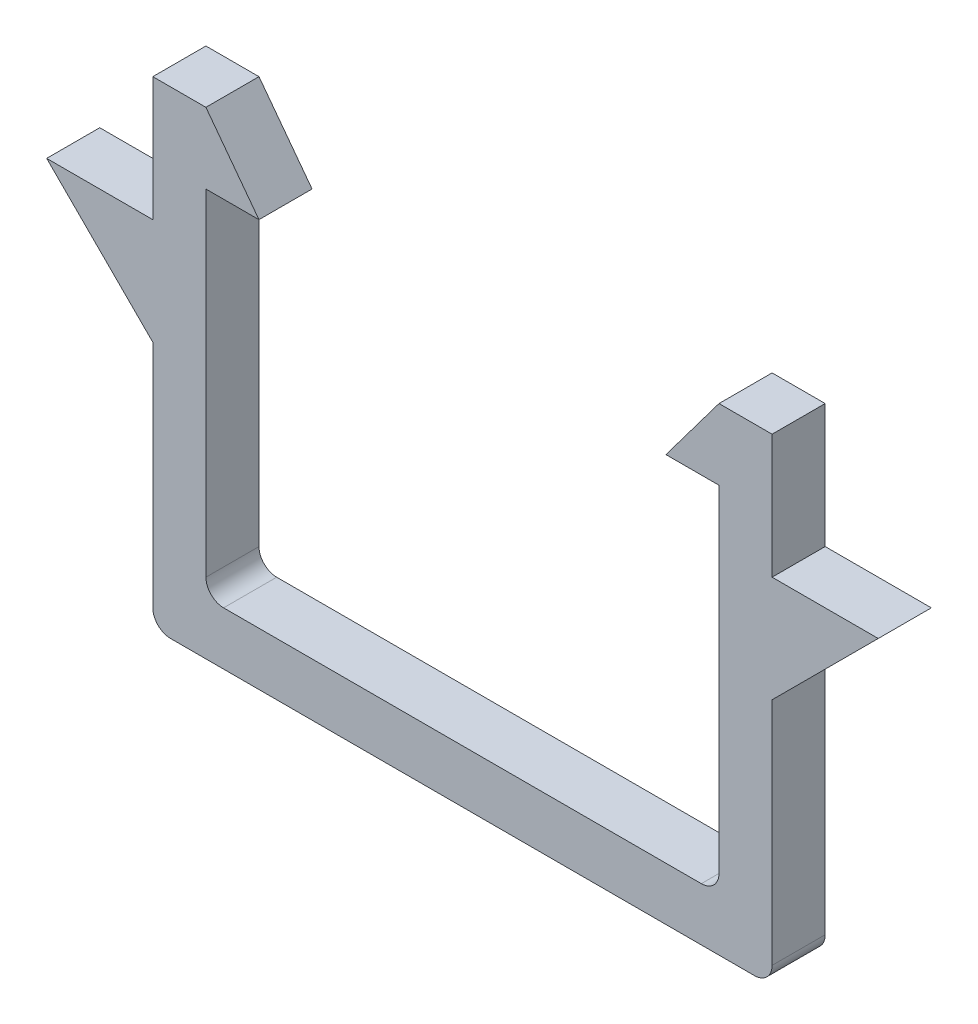
ISO-10303-21;
HEADER;
FILE_DESCRIPTION(('STEP AP214'),'2;1');
FILE_NAME('part.step','',(''),(''),'','','');
FILE_SCHEMA(('AUTOMOTIVE_DESIGN { 1 0 10303 214 1 1 1 1 }'));
ENDSEC;
DATA;
#1=APPLICATION_CONTEXT('core data for automotive mechanical design processes');
#2=APPLICATION_PROTOCOL_DEFINITION('international standard','automotive_design',2000,#1);
#3=PRODUCT_CONTEXT('',#1,'mechanical');
#4=PRODUCT('Part','Part','',(#3));
#5=PRODUCT_RELATED_PRODUCT_CATEGORY('part','',(#4));
#6=PRODUCT_DEFINITION_FORMATION('','',#4);
#7=PRODUCT_DEFINITION_CONTEXT('part definition',#1,'design');
#8=PRODUCT_DEFINITION('design','',#6,#7);
#9=PRODUCT_DEFINITION_SHAPE('','',#8);
#10=(LENGTH_UNIT() NAMED_UNIT(*) SI_UNIT(.MILLI.,.METRE.));
#11=(NAMED_UNIT(*) PLANE_ANGLE_UNIT() SI_UNIT($,.RADIAN.));
#12=(NAMED_UNIT(*) SI_UNIT($,.STERADIAN.) SOLID_ANGLE_UNIT());
#13=UNCERTAINTY_MEASURE_WITH_UNIT(LENGTH_MEASURE(1.E-05),#10,'distance_accuracy_value','');
#14=(GEOMETRIC_REPRESENTATION_CONTEXT(3) GLOBAL_UNCERTAINTY_ASSIGNED_CONTEXT((#13)) GLOBAL_UNIT_ASSIGNED_CONTEXT((#10,
#11,#12)) REPRESENTATION_CONTEXT('',''));
#15=CARTESIAN_POINT('',(0.,0.,0.));
#16=DIRECTION('',(0.,0.,1.));
#17=DIRECTION('',(1.,0.,0.));
#18=AXIS2_PLACEMENT_3D('',#15,#16,#17);
#19=CARTESIAN_POINT('',(-14.5,23.,1.5));
#20=DIRECTION('',(0.,1.,0.));
#21=DIRECTION('',(0.,0.,1.));
#22=AXIS2_PLACEMENT_3D('',#19,#20,#21);
#23=PLANE('',#22);
#24=DIRECTION('',(1.,0.,0.));
#25=VECTOR('',#24,1.);
#26=CARTESIAN_POINT('',(-14.5,23.,-1.5));
#27=LINE('',#26,#25);
#28=CARTESIAN_POINT('',(-14.5,23.,-1.5));
#29=VERTEX_POINT('',#28);
#30=CARTESIAN_POINT('',(-11.5,23.,-1.5));
#31=VERTEX_POINT('',#30);
#32=EDGE_CURVE('E228',#29,#31,#27,.T.);
#33=ORIENTED_EDGE('',*,*,#32,.T.);
#34=DIRECTION('',(0.,0.,-1.));
#35=VECTOR('',#34,1.);
#36=CARTESIAN_POINT('',(-11.5,23.,1.5));
#37=LINE('',#36,#35);
#38=CARTESIAN_POINT('',(-11.5,23.,1.5));
#39=VERTEX_POINT('',#38);
#40=EDGE_CURVE('E11',#39,#31,#37,.T.);
#41=ORIENTED_EDGE('',*,*,#40,.F.);
#42=DIRECTION('',(1.,0.,0.));
#43=VECTOR('',#42,1.);
#44=CARTESIAN_POINT('',(-14.5,23.,1.5));
#45=LINE('',#44,#43);
#46=CARTESIAN_POINT('',(-14.5,23.,1.5));
#47=VERTEX_POINT('',#46);
#48=EDGE_CURVE('E292',#47,#39,#45,.T.);
#49=ORIENTED_EDGE('',*,*,#48,.F.);
#50=DIRECTION('',(0.,0.,-1.));
#51=VECTOR('',#50,1.);
#52=CARTESIAN_POINT('',(-14.5,23.,1.5));
#53=LINE('',#52,#51);
#54=EDGE_CURVE('E224',#47,#29,#53,.T.);
#55=ORIENTED_EDGE('',*,*,#54,.T.);
#56=EDGE_LOOP('',(#33,#41,#49,#55));
#57=FACE_BOUND('',#56,.T.);
#58=ADVANCED_FACE('F43',(#57),#23,.F.);
#59=CARTESIAN_POINT('',(-14.5,27.,1.5));
#60=DIRECTION('',(-0.8,-0.6,0.));
#61=DIRECTION('',(0.6,-0.8,0.));
#62=AXIS2_PLACEMENT_3D('',#59,#60,#61);
#63=PLANE('',#62);
#64=DIRECTION('',(-0.6,0.8,0.));
#65=VECTOR('',#64,1.);
#66=CARTESIAN_POINT('',(-14.5,27.,-1.5));
#67=LINE('',#66,#65);
#68=CARTESIAN_POINT('',(-14.5,27.,-1.5));
#69=VERTEX_POINT('',#68);
#70=EDGE_CURVE('E232',#31,#69,#67,.T.);
#71=ORIENTED_EDGE('',*,*,#70,.T.);
#72=DIRECTION('',(0.,0.,-1.));
#73=VECTOR('',#72,1.);
#74=CARTESIAN_POINT('',(-14.5,27.,1.5));
#75=LINE('',#74,#73);
#76=CARTESIAN_POINT('',(-14.5,27.,1.5));
#77=VERTEX_POINT('',#76);
#78=EDGE_CURVE('E52',#77,#69,#75,.T.);
#79=ORIENTED_EDGE('',*,*,#78,.F.);
#80=DIRECTION('',(-0.6,0.8,0.));
#81=VECTOR('',#80,1.);
#82=CARTESIAN_POINT('',(-14.5,27.,1.5));
#83=LINE('',#82,#81);
#84=EDGE_CURVE('E145',#39,#77,#83,.T.);
#85=ORIENTED_EDGE('',*,*,#84,.F.);
#86=ORIENTED_EDGE('',*,*,#40,.T.);
#87=EDGE_LOOP('',(#71,#79,#85,#86));
#88=FACE_BOUND('',#87,.T.);
#89=ADVANCED_FACE('F456',(#88),#63,.F.);
#90=CARTESIAN_POINT('',(-17.5,27.,1.5));
#91=DIRECTION('',(0.,-1.,0.));
#92=DIRECTION('',(0.,0.,-1.));
#93=AXIS2_PLACEMENT_3D('',#90,#91,#92);
#94=PLANE('',#93);
#95=DIRECTION('',(-1.,0.,0.));
#96=VECTOR('',#95,1.);
#97=CARTESIAN_POINT('',(-17.5,27.,-1.5));
#98=LINE('',#97,#96);
#99=CARTESIAN_POINT('',(-17.5,27.,-1.5));
#100=VERTEX_POINT('',#99);
#101=EDGE_CURVE('E235',#69,#100,#98,.T.);
#102=ORIENTED_EDGE('',*,*,#101,.T.);
#103=DIRECTION('',(0.,0.,-1.));
#104=VECTOR('',#103,1.);
#105=CARTESIAN_POINT('',(-17.5,27.,1.5));
#106=LINE('',#105,#104);
#107=CARTESIAN_POINT('',(-17.5,27.,1.5));
#108=VERTEX_POINT('',#107);
#109=EDGE_CURVE('E359',#108,#100,#106,.T.);
#110=ORIENTED_EDGE('',*,*,#109,.F.);
#111=DIRECTION('',(-1.,0.,0.));
#112=VECTOR('',#111,1.);
#113=CARTESIAN_POINT('',(-17.5,27.,1.5));
#114=LINE('',#113,#112);
#115=EDGE_CURVE('E369',#77,#108,#114,.T.);
#116=ORIENTED_EDGE('',*,*,#115,.F.);
#117=ORIENTED_EDGE('',*,*,#78,.T.);
#118=EDGE_LOOP('',(#102,#110,#116,#117));
#119=FACE_BOUND('',#118,.T.);
#120=ADVANCED_FACE('F367',(#119),#94,.F.);
#121=CARTESIAN_POINT('',(-17.5,20.,1.5));
#122=DIRECTION('',(1.,0.,0.));
#123=DIRECTION('',(0.,0.,-1.));
#124=AXIS2_PLACEMENT_3D('',#121,#122,#123);
#125=PLANE('',#124);
#126=DIRECTION('',(0.,-1.,0.));
#127=VECTOR('',#126,1.);
#128=CARTESIAN_POINT('',(-17.5,20.,-1.5));
#129=LINE('',#128,#127);
#130=CARTESIAN_POINT('',(-17.5,20.,-1.5));
#131=VERTEX_POINT('',#130);
#132=EDGE_CURVE('E238',#100,#131,#129,.T.);
#133=ORIENTED_EDGE('',*,*,#132,.T.);
#134=DIRECTION('',(0.,0.,-1.));
#135=VECTOR('',#134,1.);
#136=CARTESIAN_POINT('',(-17.5,20.,1.5));
#137=LINE('',#136,#135);
#138=CARTESIAN_POINT('',(-17.5,20.,1.5));
#139=VERTEX_POINT('',#138);
#140=EDGE_CURVE('E355',#139,#131,#137,.T.);
#141=ORIENTED_EDGE('',*,*,#140,.F.);
#142=DIRECTION('',(0.,-1.,0.));
#143=VECTOR('',#142,1.);
#144=CARTESIAN_POINT('',(-17.5,20.,1.5));
#145=LINE('',#144,#143);
#146=EDGE_CURVE('E388',#108,#139,#145,.T.);
#147=ORIENTED_EDGE('',*,*,#146,.F.);
#148=ORIENTED_EDGE('',*,*,#109,.T.);
#149=EDGE_LOOP('',(#133,#141,#147,#148));
#150=FACE_BOUND('',#149,.T.);
#151=ADVANCED_FACE('F378',(#150),#125,.F.);
#152=CARTESIAN_POINT('',(-17.5,20.,1.5));
#153=DIRECTION('',(0.,-1.,0.));
#154=DIRECTION('',(1.,0.,0.));
#155=AXIS2_PLACEMENT_3D('',#152,#153,#154);
#156=PLANE('',#155);
#157=DIRECTION('',(-1.,0.,0.));
#158=VECTOR('',#157,1.);
#159=CARTESIAN_POINT('',(-17.5,20.,-1.5));
#160=LINE('',#159,#158);
#161=CARTESIAN_POINT('',(-23.5,20.,-1.5));
#162=VERTEX_POINT('',#161);
#163=EDGE_CURVE('E241',#131,#162,#160,.T.);
#164=ORIENTED_EDGE('',*,*,#163,.T.);
#165=DIRECTION('',(0.,0.,-1.));
#166=VECTOR('',#165,1.);
#167=CARTESIAN_POINT('',(-23.5,20.,1.5));
#168=LINE('',#167,#166);
#169=CARTESIAN_POINT('',(-23.5,20.,1.5));
#170=VERTEX_POINT('',#169);
#171=EDGE_CURVE('E351',#170,#162,#168,.T.);
#172=ORIENTED_EDGE('',*,*,#171,.F.);
#173=DIRECTION('',(-1.,0.,0.));
#174=VECTOR('',#173,1.);
#175=CARTESIAN_POINT('',(-17.5,20.,1.5));
#176=LINE('',#175,#174);
#177=EDGE_CURVE('E384',#139,#170,#176,.T.);
#178=ORIENTED_EDGE('',*,*,#177,.F.);
#179=ORIENTED_EDGE('',*,*,#140,.T.);
#180=EDGE_LOOP('',(#164,#172,#178,#179));
#181=FACE_BOUND('',#180,.T.);
#182=ADVANCED_FACE('F382',(#181),#156,.F.);
#183=CARTESIAN_POINT('',(-23.5,20.,1.5));
#184=DIRECTION('',(0.707106781186548,0.707106781186548,0.));
#185=DIRECTION('',(-0.707106781186548,0.707106781186548,0.));
#186=AXIS2_PLACEMENT_3D('',#183,#184,#185);
#187=PLANE('',#186);
#188=DIRECTION('',(0.707106781186547,-0.707106781186547,0.));
#189=VECTOR('',#188,1.);
#190=CARTESIAN_POINT('',(-23.5,20.,-1.5));
#191=LINE('',#190,#189);
#192=CARTESIAN_POINT('',(-17.5,14.,-1.5));
#193=VERTEX_POINT('',#192);
#194=EDGE_CURVE('E244',#162,#193,#191,.T.);
#195=ORIENTED_EDGE('',*,*,#194,.T.);
#196=DIRECTION('',(0.,0.,-1.));
#197=VECTOR('',#196,1.);
#198=CARTESIAN_POINT('',(-17.5,14.,1.5));
#199=LINE('',#198,#197);
#200=CARTESIAN_POINT('',(-17.5,14.,1.5));
#201=VERTEX_POINT('',#200);
#202=EDGE_CURVE('E347',#201,#193,#199,.T.);
#203=ORIENTED_EDGE('',*,*,#202,.F.);
#204=DIRECTION('',(0.707106781186547,-0.707106781186547,0.));
#205=VECTOR('',#204,1.);
#206=CARTESIAN_POINT('',(-23.5,20.,1.5));
#207=LINE('',#206,#205);
#208=EDGE_CURVE('E387',#170,#201,#207,.T.);
#209=ORIENTED_EDGE('',*,*,#208,.F.);
#210=ORIENTED_EDGE('',*,*,#171,.T.);
#211=EDGE_LOOP('',(#195,#203,#209,#210));
#212=FACE_BOUND('',#211,.T.);
#213=ADVANCED_FACE('F469',(#212),#187,.F.);
#214=CARTESIAN_POINT('',(-17.5,1.,1.5));
#215=DIRECTION('',(1.,0.,0.));
#216=DIRECTION('',(0.,0.,-1.));
#217=AXIS2_PLACEMENT_3D('',#214,#215,#216);
#218=PLANE('',#217);
#219=DIRECTION('',(0.,-1.,0.));
#220=VECTOR('',#219,1.);
#221=CARTESIAN_POINT('',(-17.5,1.,-1.5));
#222=LINE('',#221,#220);
#223=CARTESIAN_POINT('',(-17.5,1.,-1.5));
#224=VERTEX_POINT('',#223);
#225=EDGE_CURVE('E247',#193,#224,#222,.T.);
#226=ORIENTED_EDGE('',*,*,#225,.T.);
#227=DIRECTION('',(0.,0.,-1.));
#228=VECTOR('',#227,1.);
#229=CARTESIAN_POINT('',(-17.5,1.,1.5));
#230=LINE('',#229,#228);
#231=CARTESIAN_POINT('',(-17.5,1.,1.5));
#232=VERTEX_POINT('',#231);
#233=EDGE_CURVE('E343',#232,#224,#230,.T.);
#234=ORIENTED_EDGE('',*,*,#233,.F.);
#235=DIRECTION('',(0.,-1.,0.));
#236=VECTOR('',#235,1.);
#237=CARTESIAN_POINT('',(-17.5,1.,1.5));
#238=LINE('',#237,#236);
#239=EDGE_CURVE('E392',#201,#232,#238,.T.);
#240=ORIENTED_EDGE('',*,*,#239,.F.);
#241=ORIENTED_EDGE('',*,*,#202,.T.);
#242=EDGE_LOOP('',(#226,#234,#240,#241));
#243=FACE_BOUND('',#242,.T.);
#244=ADVANCED_FACE('F472',(#243),#218,.F.);
#245=CARTESIAN_POINT('',(-16.5,1.,1.5));
#246=DIRECTION('',(0.,0.,-1.));
#247=DIRECTION('',(-1.,0.,0.));
#248=AXIS2_PLACEMENT_3D('',#245,#246,#247);
#249=CYLINDRICAL_SURFACE('',#248,1.);
#250=CARTESIAN_POINT('',(-16.5,1.,-1.5));
#251=DIRECTION('',(0.,0.,1.));
#252=DIRECTION('',(-1.,0.,0.));
#253=AXIS2_PLACEMENT_3D('',#250,#251,#252);
#254=CIRCLE('',#253,1.);
#255=CARTESIAN_POINT('',(-16.5,0.,-1.5));
#256=VERTEX_POINT('',#255);
#257=EDGE_CURVE('E250',#224,#256,#254,.T.);
#258=ORIENTED_EDGE('',*,*,#257,.T.);
#259=DIRECTION('',(0.,0.,-1.));
#260=VECTOR('',#259,1.);
#261=CARTESIAN_POINT('',(-16.5,0.,1.5));
#262=LINE('',#261,#260);
#263=CARTESIAN_POINT('',(-16.5,0.,1.5));
#264=VERTEX_POINT('',#263);
#265=EDGE_CURVE('E339',#264,#256,#262,.T.);
#266=ORIENTED_EDGE('',*,*,#265,.F.);
#267=CARTESIAN_POINT('',(-16.5,1.,1.5));
#268=DIRECTION('',(0.,0.,1.));
#269=DIRECTION('',(-1.,0.,0.));
#270=AXIS2_PLACEMENT_3D('',#267,#268,#269);
#271=CIRCLE('',#270,1.);
#272=EDGE_CURVE('E399',#232,#264,#271,.T.);
#273=ORIENTED_EDGE('',*,*,#272,.F.);
#274=ORIENTED_EDGE('',*,*,#233,.T.);
#275=EDGE_LOOP('',(#258,#266,#273,#274));
#276=FACE_BOUND('',#275,.T.);
#277=ADVANCED_FACE('F476',(#276),#249,.T.);
#278=CARTESIAN_POINT('',(-16.5,0.,1.5));
#279=DIRECTION('',(0.,1.,0.));
#280=DIRECTION('',(0.,0.,1.));
#281=AXIS2_PLACEMENT_3D('',#278,#279,#280);
#282=PLANE('',#281);
#283=DIRECTION('',(1.,0.,0.));
#284=VECTOR('',#283,1.);
#285=CARTESIAN_POINT('',(-16.5,0.,-1.5));
#286=LINE('',#285,#284);
#287=CARTESIAN_POINT('',(16.5,0.,-1.5));
#288=VERTEX_POINT('',#287);
#289=EDGE_CURVE('E253',#256,#288,#286,.T.);
#290=ORIENTED_EDGE('',*,*,#289,.T.);
#291=DIRECTION('',(0.,0.,-1.));
#292=VECTOR('',#291,1.);
#293=CARTESIAN_POINT('',(16.5,0.,1.5));
#294=LINE('',#293,#292);
#295=CARTESIAN_POINT('',(16.5,0.,1.5));
#296=VERTEX_POINT('',#295);
#297=EDGE_CURVE('E335',#296,#288,#294,.T.);
#298=ORIENTED_EDGE('',*,*,#297,.F.);
#299=DIRECTION('',(1.,0.,0.));
#300=VECTOR('',#299,1.);
#301=CARTESIAN_POINT('',(-16.5,0.,1.5));
#302=LINE('',#301,#300);
#303=EDGE_CURVE('E402',#264,#296,#302,.T.);
#304=ORIENTED_EDGE('',*,*,#303,.F.);
#305=ORIENTED_EDGE('',*,*,#265,.T.);
#306=EDGE_LOOP('',(#290,#298,#304,#305));
#307=FACE_BOUND('',#306,.T.);
#308=ADVANCED_FACE('F480',(#307),#282,.F.);
#309=CARTESIAN_POINT('',(16.5,1.,1.5));
#310=DIRECTION('',(0.,0.,-1.));
#311=DIRECTION('',(-1.,0.,0.));
#312=AXIS2_PLACEMENT_3D('',#309,#310,#311);
#313=CYLINDRICAL_SURFACE('',#312,0.999999999999999);
#314=CARTESIAN_POINT('',(16.5,1.,-1.5));
#315=DIRECTION('',(0.,0.,1.));
#316=DIRECTION('',(-1.,0.,0.));
#317=AXIS2_PLACEMENT_3D('',#314,#315,#316);
#318=CIRCLE('',#317,0.999999999999999);
#319=CARTESIAN_POINT('',(17.5,1.,-1.5));
#320=VERTEX_POINT('',#319);
#321=EDGE_CURVE('E256',#288,#320,#318,.T.);
#322=ORIENTED_EDGE('',*,*,#321,.T.);
#323=DIRECTION('',(0.,0.,-1.));
#324=VECTOR('',#323,1.);
#325=CARTESIAN_POINT('',(17.5,1.,1.5));
#326=LINE('',#325,#324);
#327=CARTESIAN_POINT('',(17.5,1.,1.5));
#328=VERTEX_POINT('',#327);
#329=EDGE_CURVE('E331',#328,#320,#326,.T.);
#330=ORIENTED_EDGE('',*,*,#329,.F.);
#331=CARTESIAN_POINT('',(16.5,1.,1.5));
#332=DIRECTION('',(0.,0.,1.));
#333=DIRECTION('',(-1.,0.,0.));
#334=AXIS2_PLACEMENT_3D('',#331,#332,#333);
#335=CIRCLE('',#334,0.999999999999999);
#336=EDGE_CURVE('E405',#296,#328,#335,.T.);
#337=ORIENTED_EDGE('',*,*,#336,.F.);
#338=ORIENTED_EDGE('',*,*,#297,.T.);
#339=EDGE_LOOP('',(#322,#330,#337,#338));
#340=FACE_BOUND('',#339,.T.);
#341=ADVANCED_FACE('F484',(#340),#313,.T.);
#342=CARTESIAN_POINT('',(17.5,1.,1.5));
#343=DIRECTION('',(-1.,0.,0.));
#344=DIRECTION('',(0.,0.,1.));
#345=AXIS2_PLACEMENT_3D('',#342,#343,#344);
#346=PLANE('',#345);
#347=DIRECTION('',(0.,1.,0.));
#348=VECTOR('',#347,1.);
#349=CARTESIAN_POINT('',(17.5,1.,-1.5));
#350=LINE('',#349,#348);
#351=CARTESIAN_POINT('',(17.5,14.,-1.5));
#352=VERTEX_POINT('',#351);
#353=EDGE_CURVE('E259',#320,#352,#350,.T.);
#354=ORIENTED_EDGE('',*,*,#353,.T.);
#355=DIRECTION('',(0.,0.,-1.));
#356=VECTOR('',#355,1.);
#357=CARTESIAN_POINT('',(17.5,14.,1.5));
#358=LINE('',#357,#356);
#359=CARTESIAN_POINT('',(17.5,14.,1.5));
#360=VERTEX_POINT('',#359);
#361=EDGE_CURVE('E327',#360,#352,#358,.T.);
#362=ORIENTED_EDGE('',*,*,#361,.F.);
#363=DIRECTION('',(0.,1.,0.));
#364=VECTOR('',#363,1.);
#365=CARTESIAN_POINT('',(17.5,1.,1.5));
#366=LINE('',#365,#364);
#367=EDGE_CURVE('E408',#328,#360,#366,.T.);
#368=ORIENTED_EDGE('',*,*,#367,.F.);
#369=ORIENTED_EDGE('',*,*,#329,.T.);
#370=EDGE_LOOP('',(#354,#362,#368,#369));
#371=FACE_BOUND('',#370,.T.);
#372=ADVANCED_FACE('F488',(#371),#346,.F.);
#373=CARTESIAN_POINT('',(23.5,20.,1.5));
#374=DIRECTION('',(-0.707106781186548,0.707106781186548,0.));
#375=DIRECTION('',(-0.707106781186548,-0.707106781186548,0.));
#376=AXIS2_PLACEMENT_3D('',#373,#374,#375);
#377=PLANE('',#376);
#378=DIRECTION('',(0.707106781186547,0.707106781186547,0.));
#379=VECTOR('',#378,1.);
#380=CARTESIAN_POINT('',(23.5,20.,-1.5));
#381=LINE('',#380,#379);
#382=CARTESIAN_POINT('',(23.5,20.,-1.5));
#383=VERTEX_POINT('',#382);
#384=EDGE_CURVE('E262',#352,#383,#381,.T.);
#385=ORIENTED_EDGE('',*,*,#384,.T.);
#386=DIRECTION('',(0.,0.,-1.));
#387=VECTOR('',#386,1.);
#388=CARTESIAN_POINT('',(23.5,20.,1.5));
#389=LINE('',#388,#387);
#390=CARTESIAN_POINT('',(23.5,20.,1.5));
#391=VERTEX_POINT('',#390);
#392=EDGE_CURVE('E323',#391,#383,#389,.T.);
#393=ORIENTED_EDGE('',*,*,#392,.F.);
#394=DIRECTION('',(0.707106781186547,0.707106781186547,0.));
#395=VECTOR('',#394,1.);
#396=CARTESIAN_POINT('',(23.5,20.,1.5));
#397=LINE('',#396,#395);
#398=EDGE_CURVE('E411',#360,#391,#397,.T.);
#399=ORIENTED_EDGE('',*,*,#398,.F.);
#400=ORIENTED_EDGE('',*,*,#361,.T.);
#401=EDGE_LOOP('',(#385,#393,#399,#400));
#402=FACE_BOUND('',#401,.T.);
#403=ADVANCED_FACE('F492',(#402),#377,.F.);
#404=CARTESIAN_POINT('',(17.5,20.,1.5));
#405=DIRECTION('',(0.,-1.,0.));
#406=DIRECTION('',(1.,0.,0.));
#407=AXIS2_PLACEMENT_3D('',#404,#405,#406);
#408=PLANE('',#407);
#409=DIRECTION('',(-1.,0.,0.));
#410=VECTOR('',#409,1.);
#411=CARTESIAN_POINT('',(17.5,20.,-1.5));
#412=LINE('',#411,#410);
#413=CARTESIAN_POINT('',(17.5,20.,-1.5));
#414=VERTEX_POINT('',#413);
#415=EDGE_CURVE('E265',#383,#414,#412,.T.);
#416=ORIENTED_EDGE('',*,*,#415,.T.);
#417=DIRECTION('',(0.,0.,-1.));
#418=VECTOR('',#417,1.);
#419=CARTESIAN_POINT('',(17.5,20.,1.5));
#420=LINE('',#419,#418);
#421=CARTESIAN_POINT('',(17.5,20.,1.5));
#422=VERTEX_POINT('',#421);
#423=EDGE_CURVE('E319',#422,#414,#420,.T.);
#424=ORIENTED_EDGE('',*,*,#423,.F.);
#425=DIRECTION('',(-1.,0.,0.));
#426=VECTOR('',#425,1.);
#427=CARTESIAN_POINT('',(17.5,20.,1.5));
#428=LINE('',#427,#426);
#429=EDGE_CURVE('E414',#391,#422,#428,.T.);
#430=ORIENTED_EDGE('',*,*,#429,.F.);
#431=ORIENTED_EDGE('',*,*,#392,.T.);
#432=EDGE_LOOP('',(#416,#424,#430,#431));
#433=FACE_BOUND('',#432,.T.);
#434=ADVANCED_FACE('F496',(#433),#408,.F.);
#435=CARTESIAN_POINT('',(17.5,20.,1.5));
#436=DIRECTION('',(-1.,0.,0.));
#437=DIRECTION('',(0.,-1.,0.));
#438=AXIS2_PLACEMENT_3D('',#435,#436,#437);
#439=PLANE('',#438);
#440=DIRECTION('',(0.,1.,0.));
#441=VECTOR('',#440,1.);
#442=CARTESIAN_POINT('',(17.5,20.,-1.5));
#443=LINE('',#442,#441);
#444=CARTESIAN_POINT('',(17.5,27.,-1.5));
#445=VERTEX_POINT('',#444);
#446=EDGE_CURVE('E268',#414,#445,#443,.T.);
#447=ORIENTED_EDGE('',*,*,#446,.T.);
#448=DIRECTION('',(0.,0.,-1.));
#449=VECTOR('',#448,1.);
#450=CARTESIAN_POINT('',(17.5,27.,1.5));
#451=LINE('',#450,#449);
#452=CARTESIAN_POINT('',(17.5,27.,1.5));
#453=VERTEX_POINT('',#452);
#454=EDGE_CURVE('E315',#453,#445,#451,.T.);
#455=ORIENTED_EDGE('',*,*,#454,.F.);
#456=DIRECTION('',(0.,1.,0.));
#457=VECTOR('',#456,1.);
#458=CARTESIAN_POINT('',(17.5,20.,1.5));
#459=LINE('',#458,#457);
#460=EDGE_CURVE('E417',#422,#453,#459,.T.);
#461=ORIENTED_EDGE('',*,*,#460,.F.);
#462=ORIENTED_EDGE('',*,*,#423,.T.);
#463=EDGE_LOOP('',(#447,#455,#461,#462));
#464=FACE_BOUND('',#463,.T.);
#465=ADVANCED_FACE('F500',(#464),#439,.F.);
#466=CARTESIAN_POINT('',(17.5,27.,1.5));
#467=DIRECTION('',(0.,-1.,0.));
#468=DIRECTION('',(0.,0.,-1.));
#469=AXIS2_PLACEMENT_3D('',#466,#467,#468);
#470=PLANE('',#469);
#471=DIRECTION('',(-1.,0.,0.));
#472=VECTOR('',#471,1.);
#473=CARTESIAN_POINT('',(17.5,27.,-1.5));
#474=LINE('',#473,#472);
#475=CARTESIAN_POINT('',(14.5,27.,-1.5));
#476=VERTEX_POINT('',#475);
#477=EDGE_CURVE('E271',#445,#476,#474,.T.);
#478=ORIENTED_EDGE('',*,*,#477,.T.);
#479=DIRECTION('',(0.,0.,-1.));
#480=VECTOR('',#479,1.);
#481=CARTESIAN_POINT('',(14.5,27.,1.5));
#482=LINE('',#481,#480);
#483=CARTESIAN_POINT('',(14.5,27.,1.5));
#484=VERTEX_POINT('',#483);
#485=EDGE_CURVE('E311',#484,#476,#482,.T.);
#486=ORIENTED_EDGE('',*,*,#485,.F.);
#487=DIRECTION('',(-1.,0.,0.));
#488=VECTOR('',#487,1.);
#489=CARTESIAN_POINT('',(17.5,27.,1.5));
#490=LINE('',#489,#488);
#491=EDGE_CURVE('E420',#453,#484,#490,.T.);
#492=ORIENTED_EDGE('',*,*,#491,.F.);
#493=ORIENTED_EDGE('',*,*,#454,.T.);
#494=EDGE_LOOP('',(#478,#486,#492,#493));
#495=FACE_BOUND('',#494,.T.);
#496=ADVANCED_FACE('F504',(#495),#470,.F.);
#497=CARTESIAN_POINT('',(11.5,23.,1.5));
#498=DIRECTION('',(0.8,-0.6,0.));
#499=DIRECTION('',(0.6,0.8,0.));
#500=AXIS2_PLACEMENT_3D('',#497,#498,#499);
#501=PLANE('',#500);
#502=DIRECTION('',(-0.6,-0.8,0.));
#503=VECTOR('',#502,1.);
#504=CARTESIAN_POINT('',(11.5,23.,-1.5));
#505=LINE('',#504,#503);
#506=CARTESIAN_POINT('',(11.5,23.,-1.5));
#507=VERTEX_POINT('',#506);
#508=EDGE_CURVE('E274',#476,#507,#505,.T.);
#509=ORIENTED_EDGE('',*,*,#508,.T.);
#510=DIRECTION('',(0.,0.,-1.));
#511=VECTOR('',#510,1.);
#512=CARTESIAN_POINT('',(11.5,23.,1.5));
#513=LINE('',#512,#511);
#514=CARTESIAN_POINT('',(11.5,23.,1.5));
#515=VERTEX_POINT('',#514);
#516=EDGE_CURVE('E307',#515,#507,#513,.T.);
#517=ORIENTED_EDGE('',*,*,#516,.F.);
#518=DIRECTION('',(-0.6,-0.8,0.));
#519=VECTOR('',#518,1.);
#520=CARTESIAN_POINT('',(11.5,23.,1.5));
#521=LINE('',#520,#519);
#522=EDGE_CURVE('E423',#484,#515,#521,.T.);
#523=ORIENTED_EDGE('',*,*,#522,.F.);
#524=ORIENTED_EDGE('',*,*,#485,.T.);
#525=EDGE_LOOP('',(#509,#517,#523,#524));
#526=FACE_BOUND('',#525,.T.);
#527=ADVANCED_FACE('F508',(#526),#501,.F.);
#528=CARTESIAN_POINT('',(14.5,23.,1.5));
#529=DIRECTION('',(0.,1.,0.));
#530=DIRECTION('',(0.,0.,1.));
#531=AXIS2_PLACEMENT_3D('',#528,#529,#530);
#532=PLANE('',#531);
#533=DIRECTION('',(1.,0.,0.));
#534=VECTOR('',#533,1.);
#535=CARTESIAN_POINT('',(14.5,23.,-1.5));
#536=LINE('',#535,#534);
#537=CARTESIAN_POINT('',(14.5,23.,-1.5));
#538=VERTEX_POINT('',#537);
#539=EDGE_CURVE('E277',#507,#538,#536,.T.);
#540=ORIENTED_EDGE('',*,*,#539,.T.);
#541=DIRECTION('',(0.,0.,-1.));
#542=VECTOR('',#541,1.);
#543=CARTESIAN_POINT('',(14.5,23.,1.5));
#544=LINE('',#543,#542);
#545=CARTESIAN_POINT('',(14.5,23.,1.5));
#546=VERTEX_POINT('',#545);
#547=EDGE_CURVE('E303',#546,#538,#544,.T.);
#548=ORIENTED_EDGE('',*,*,#547,.F.);
#549=DIRECTION('',(1.,0.,0.));
#550=VECTOR('',#549,1.);
#551=CARTESIAN_POINT('',(14.5,23.,1.5));
#552=LINE('',#551,#550);
#553=EDGE_CURVE('E426',#515,#546,#552,.T.);
#554=ORIENTED_EDGE('',*,*,#553,.F.);
#555=ORIENTED_EDGE('',*,*,#516,.T.);
#556=EDGE_LOOP('',(#540,#548,#554,#555));
#557=FACE_BOUND('',#556,.T.);
#558=ADVANCED_FACE('F512',(#557),#532,.F.);
#559=CARTESIAN_POINT('',(14.5,4.,1.5));
#560=DIRECTION('',(1.,0.,0.));
#561=DIRECTION('',(0.,1.,0.));
#562=AXIS2_PLACEMENT_3D('',#559,#560,#561);
#563=PLANE('',#562);
#564=DIRECTION('',(0.,-1.,0.));
#565=VECTOR('',#564,1.);
#566=CARTESIAN_POINT('',(14.5,4.,-1.5));
#567=LINE('',#566,#565);
#568=CARTESIAN_POINT('',(14.5,4.,-1.5));
#569=VERTEX_POINT('',#568);
#570=EDGE_CURVE('E280',#538,#569,#567,.T.);
#571=ORIENTED_EDGE('',*,*,#570,.T.);
#572=DIRECTION('',(0.,0.,-1.));
#573=VECTOR('',#572,1.);
#574=CARTESIAN_POINT('',(14.5,4.,1.5));
#575=LINE('',#574,#573);
#576=CARTESIAN_POINT('',(14.5,4.,1.5));
#577=VERTEX_POINT('',#576);
#578=EDGE_CURVE('E299',#577,#569,#575,.T.);
#579=ORIENTED_EDGE('',*,*,#578,.F.);
#580=DIRECTION('',(0.,-1.,0.));
#581=VECTOR('',#580,1.);
#582=CARTESIAN_POINT('',(14.5,4.,1.5));
#583=LINE('',#582,#581);
#584=EDGE_CURVE('E429',#546,#577,#583,.T.);
#585=ORIENTED_EDGE('',*,*,#584,.F.);
#586=ORIENTED_EDGE('',*,*,#547,.T.);
#587=EDGE_LOOP('',(#571,#579,#585,#586));
#588=FACE_BOUND('',#587,.T.);
#589=ADVANCED_FACE('F437',(#588),#563,.F.);
#590=CARTESIAN_POINT('',(13.5,4.,1.5));
#591=DIRECTION('',(0.,0.,-1.));
#592=DIRECTION('',(-1.,0.,0.));
#593=AXIS2_PLACEMENT_3D('',#590,#591,#592);
#594=CYLINDRICAL_SURFACE('',#593,1.);
#595=CARTESIAN_POINT('',(13.5,4.,-1.5));
#596=DIRECTION('',(0.,0.,-1.));
#597=DIRECTION('',(-1.,0.,0.));
#598=AXIS2_PLACEMENT_3D('',#595,#596,#597);
#599=CIRCLE('',#598,1.);
#600=CARTESIAN_POINT('',(13.5,3.,-1.5));
#601=VERTEX_POINT('',#600);
#602=EDGE_CURVE('E283',#569,#601,#599,.T.);
#603=ORIENTED_EDGE('',*,*,#602,.T.);
#604=DIRECTION('',(0.,0.,-1.));
#605=VECTOR('',#604,1.);
#606=CARTESIAN_POINT('',(13.5,3.,1.5));
#607=LINE('',#606,#605);
#608=CARTESIAN_POINT('',(13.5,3.,1.5));
#609=VERTEX_POINT('',#608);
#610=EDGE_CURVE('E217',#609,#601,#607,.T.);
#611=ORIENTED_EDGE('',*,*,#610,.F.);
#612=CARTESIAN_POINT('',(13.5,4.,1.5));
#613=DIRECTION('',(0.,0.,-1.));
#614=DIRECTION('',(-1.,0.,0.));
#615=AXIS2_PLACEMENT_3D('',#612,#613,#614);
#616=CIRCLE('',#615,1.);
#617=EDGE_CURVE('E206',#577,#609,#616,.T.);
#618=ORIENTED_EDGE('',*,*,#617,.F.);
#619=ORIENTED_EDGE('',*,*,#578,.T.);
#620=EDGE_LOOP('',(#603,#611,#618,#619));
#621=FACE_BOUND('',#620,.T.);
#622=ADVANCED_FACE('F441',(#621),#594,.F.);
#623=CARTESIAN_POINT('',(-13.5,3.,1.5));
#624=DIRECTION('',(0.,-1.,0.));
#625=DIRECTION('',(1.,0.,0.));
#626=AXIS2_PLACEMENT_3D('',#623,#624,#625);
#627=PLANE('',#626);
#628=DIRECTION('',(-1.,0.,0.));
#629=VECTOR('',#628,1.);
#630=CARTESIAN_POINT('',(-13.5,3.,-1.5));
#631=LINE('',#630,#629);
#632=CARTESIAN_POINT('',(-13.5,3.,-1.5));
#633=VERTEX_POINT('',#632);
#634=EDGE_CURVE('E215',#601,#633,#631,.T.);
#635=ORIENTED_EDGE('',*,*,#634,.T.);
#636=DIRECTION('',(0.,0.,-1.));
#637=VECTOR('',#636,1.);
#638=CARTESIAN_POINT('',(-13.5,3.,1.5));
#639=LINE('',#638,#637);
#640=CARTESIAN_POINT('',(-13.5,3.,1.5));
#641=VERTEX_POINT('',#640);
#642=EDGE_CURVE('E212',#641,#633,#639,.T.);
#643=ORIENTED_EDGE('',*,*,#642,.F.);
#644=DIRECTION('',(-1.,0.,0.));
#645=VECTOR('',#644,1.);
#646=CARTESIAN_POINT('',(-13.5,3.,1.5));
#647=LINE('',#646,#645);
#648=EDGE_CURVE('E200',#609,#641,#647,.T.);
#649=ORIENTED_EDGE('',*,*,#648,.F.);
#650=ORIENTED_EDGE('',*,*,#610,.T.);
#651=EDGE_LOOP('',(#635,#643,#649,#650));
#652=FACE_BOUND('',#651,.T.);
#653=ADVANCED_FACE('F213',(#652),#627,.F.);
#654=CARTESIAN_POINT('',(-13.5,4.,1.5));
#655=DIRECTION('',(0.,0.,-1.));
#656=DIRECTION('',(-1.,0.,0.));
#657=AXIS2_PLACEMENT_3D('',#654,#655,#656);
#658=CYLINDRICAL_SURFACE('',#657,1.);
#659=CARTESIAN_POINT('',(-13.5,4.,-1.5));
#660=DIRECTION('',(0.,0.,-1.));
#661=DIRECTION('',(-1.,0.,0.));
#662=AXIS2_PLACEMENT_3D('',#659,#660,#661);
#663=CIRCLE('',#662,1.);
#664=CARTESIAN_POINT('',(-14.5,4.,-1.5));
#665=VERTEX_POINT('',#664);
#666=EDGE_CURVE('E131',#633,#665,#663,.T.);
#667=ORIENTED_EDGE('',*,*,#666,.T.);
#668=DIRECTION('',(0.,0.,-1.));
#669=VECTOR('',#668,1.);
#670=CARTESIAN_POINT('',(-14.5,4.,1.5));
#671=LINE('',#670,#669);
#672=CARTESIAN_POINT('',(-14.5,4.,1.5));
#673=VERTEX_POINT('',#672);
#674=EDGE_CURVE('E218',#673,#665,#671,.T.);
#675=ORIENTED_EDGE('',*,*,#674,.F.);
#676=CARTESIAN_POINT('',(-13.5,4.,1.5));
#677=DIRECTION('',(0.,0.,-1.));
#678=DIRECTION('',(-1.,0.,0.));
#679=AXIS2_PLACEMENT_3D('',#676,#677,#678);
#680=CIRCLE('',#679,1.);
#681=EDGE_CURVE('E204',#641,#673,#680,.T.);
#682=ORIENTED_EDGE('',*,*,#681,.F.);
#683=ORIENTED_EDGE('',*,*,#642,.T.);
#684=EDGE_LOOP('',(#667,#675,#682,#683));
#685=FACE_BOUND('',#684,.T.);
#686=ADVANCED_FACE('F220',(#685),#658,.F.);
#687=CARTESIAN_POINT('',(-14.5,23.,1.5));
#688=DIRECTION('',(-1.,0.,0.));
#689=DIRECTION('',(0.,0.,1.));
#690=AXIS2_PLACEMENT_3D('',#687,#688,#689);
#691=PLANE('',#690);
#692=DIRECTION('',(0.,1.,0.));
#693=VECTOR('',#692,1.);
#694=CARTESIAN_POINT('',(-14.5,23.,-1.5));
#695=LINE('',#694,#693);
#696=EDGE_CURVE('E137',#665,#29,#695,.T.);
#697=ORIENTED_EDGE('',*,*,#696,.T.);
#698=ORIENTED_EDGE('',*,*,#54,.F.);
#699=DIRECTION('',(0.,1.,0.));
#700=VECTOR('',#699,1.);
#701=CARTESIAN_POINT('',(-14.5,23.,1.5));
#702=LINE('',#701,#700);
#703=EDGE_CURVE('E60',#673,#47,#702,.T.);
#704=ORIENTED_EDGE('',*,*,#703,.F.);
#705=ORIENTED_EDGE('',*,*,#674,.T.);
#706=EDGE_LOOP('',(#697,#698,#704,#705));
#707=FACE_BOUND('',#706,.T.);
#708=ADVANCED_FACE('F445',(#707),#691,.F.);
#709=CARTESIAN_POINT('',(-16.5,1.,1.5));
#710=DIRECTION('',(0.,0.,-1.));
#711=DIRECTION('',(-1.,0.,0.));
#712=AXIS2_PLACEMENT_3D('',#709,#710,#711);
#713=PLANE('',#712);
#714=ORIENTED_EDGE('',*,*,#48,.T.);
#715=ORIENTED_EDGE('',*,*,#84,.T.);
#716=ORIENTED_EDGE('',*,*,#115,.T.);
#717=ORIENTED_EDGE('',*,*,#146,.T.);
#718=ORIENTED_EDGE('',*,*,#177,.T.);
#719=ORIENTED_EDGE('',*,*,#208,.T.);
#720=ORIENTED_EDGE('',*,*,#239,.T.);
#721=ORIENTED_EDGE('',*,*,#272,.T.);
#722=ORIENTED_EDGE('',*,*,#303,.T.);
#723=ORIENTED_EDGE('',*,*,#336,.T.);
#724=ORIENTED_EDGE('',*,*,#367,.T.);
#725=ORIENTED_EDGE('',*,*,#398,.T.);
#726=ORIENTED_EDGE('',*,*,#429,.T.);
#727=ORIENTED_EDGE('',*,*,#460,.T.);
#728=ORIENTED_EDGE('',*,*,#491,.T.);
#729=ORIENTED_EDGE('',*,*,#522,.T.);
#730=ORIENTED_EDGE('',*,*,#553,.T.);
#731=ORIENTED_EDGE('',*,*,#584,.T.);
#732=ORIENTED_EDGE('',*,*,#617,.T.);
#733=ORIENTED_EDGE('',*,*,#648,.T.);
#734=ORIENTED_EDGE('',*,*,#681,.T.);
#735=ORIENTED_EDGE('',*,*,#703,.T.);
#736=EDGE_LOOP('',(#714,#715,#716,#717,#718,#719,#720,#721,#722,#723,#724,#725,#726,#727,#728,
#729,#730,#731,#732,#733,#734,#735));
#737=FACE_BOUND('',#736,.T.);
#738=ADVANCED_FACE('F202',(#737),#713,.F.);
#739=CARTESIAN_POINT('',(-16.5,1.,-1.5));
#740=DIRECTION('',(0.,0.,-1.));
#741=DIRECTION('',(-1.,0.,0.));
#742=AXIS2_PLACEMENT_3D('',#739,#740,#741);
#743=PLANE('',#742);
#744=ORIENTED_EDGE('',*,*,#32,.F.);
#745=ORIENTED_EDGE('',*,*,#696,.F.);
#746=ORIENTED_EDGE('',*,*,#666,.F.);
#747=ORIENTED_EDGE('',*,*,#634,.F.);
#748=ORIENTED_EDGE('',*,*,#602,.F.);
#749=ORIENTED_EDGE('',*,*,#570,.F.);
#750=ORIENTED_EDGE('',*,*,#539,.F.);
#751=ORIENTED_EDGE('',*,*,#508,.F.);
#752=ORIENTED_EDGE('',*,*,#477,.F.);
#753=ORIENTED_EDGE('',*,*,#446,.F.);
#754=ORIENTED_EDGE('',*,*,#415,.F.);
#755=ORIENTED_EDGE('',*,*,#384,.F.);
#756=ORIENTED_EDGE('',*,*,#353,.F.);
#757=ORIENTED_EDGE('',*,*,#321,.F.);
#758=ORIENTED_EDGE('',*,*,#289,.F.);
#759=ORIENTED_EDGE('',*,*,#257,.F.);
#760=ORIENTED_EDGE('',*,*,#225,.F.);
#761=ORIENTED_EDGE('',*,*,#194,.F.);
#762=ORIENTED_EDGE('',*,*,#163,.F.);
#763=ORIENTED_EDGE('',*,*,#132,.F.);
#764=ORIENTED_EDGE('',*,*,#101,.F.);
#765=ORIENTED_EDGE('',*,*,#70,.F.);
#766=EDGE_LOOP('',(#744,#745,#746,#747,#748,#749,#750,#751,#752,#753,#754,#755,#756,#757,#758,
#759,#760,#761,#762,#763,#764,#765));
#767=FACE_BOUND('',#766,.T.);
#768=ADVANCED_FACE('F373',(#767),#743,.T.);
#769=CLOSED_SHELL('',(#58,#89,#120,#151,#182,#213,#244,#277,#308,#341,#372,#403,#434,#465,#496,
#527,#558,#589,#622,#653,#686,#708,#738,#768));
#770=MANIFOLD_SOLID_BREP('B2',#769);
#771=ADVANCED_BREP_SHAPE_REPRESENTATION('',(#18,#770),#14);
#772=SHAPE_DEFINITION_REPRESENTATION(#9,#771);
ENDSEC;
END-ISO-10303-21;
